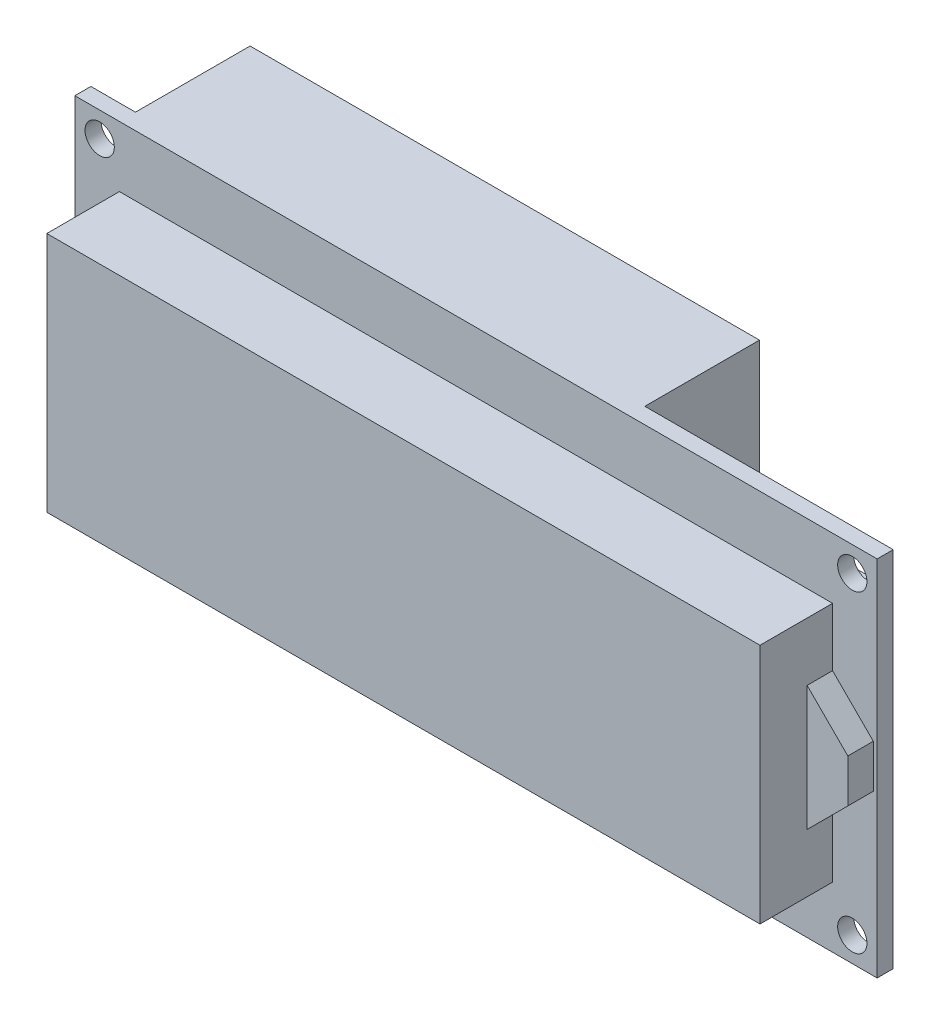
ISO-10303-21;
HEADER;
FILE_DESCRIPTION(('STEP AP214'),'2;1');
FILE_NAME('part.step','',(''),(''),'','','');
FILE_SCHEMA(('AUTOMOTIVE_DESIGN { 1 0 10303 214 1 1 1 1 }'));
ENDSEC;
DATA;
#1=APPLICATION_CONTEXT('core data for automotive mechanical design processes');
#2=APPLICATION_PROTOCOL_DEFINITION('international standard','automotive_design',2000,#1);
#3=PRODUCT_CONTEXT('',#1,'mechanical');
#4=PRODUCT('Part','Part','',(#3));
#5=PRODUCT_RELATED_PRODUCT_CATEGORY('part','',(#4));
#6=PRODUCT_DEFINITION_FORMATION('','',#4);
#7=PRODUCT_DEFINITION_CONTEXT('part definition',#1,'design');
#8=PRODUCT_DEFINITION('design','',#6,#7);
#9=PRODUCT_DEFINITION_SHAPE('','',#8);
#10=(LENGTH_UNIT() NAMED_UNIT(*) SI_UNIT(.MILLI.,.METRE.));
#11=(NAMED_UNIT(*) PLANE_ANGLE_UNIT() SI_UNIT($,.RADIAN.));
#12=(NAMED_UNIT(*) SI_UNIT($,.STERADIAN.) SOLID_ANGLE_UNIT());
#13=UNCERTAINTY_MEASURE_WITH_UNIT(LENGTH_MEASURE(1.E-05),#10,'distance_accuracy_value','');
#14=(GEOMETRIC_REPRESENTATION_CONTEXT(3) GLOBAL_UNCERTAINTY_ASSIGNED_CONTEXT((#13)) GLOBAL_UNIT_ASSIGNED_CONTEXT((#10,
#11,#12)) REPRESENTATION_CONTEXT('',''));
#15=CARTESIAN_POINT('',(0.,0.,0.));
#16=DIRECTION('',(0.,0.,1.));
#17=DIRECTION('',(1.,0.,0.));
#18=AXIS2_PLACEMENT_3D('',#15,#16,#17);
#19=CARTESIAN_POINT('',(0.,0.,0.));
#20=DIRECTION('',(0.,0.,-1.));
#21=DIRECTION('',(-1.,0.,0.));
#22=AXIS2_PLACEMENT_3D('',#19,#20,#21);
#23=PLANE('',#22);
#24=CARTESIAN_POINT('',(-37.5285,-15.621,0.));
#25=DIRECTION('',(0.,0.,1.));
#26=DIRECTION('',(-1.,0.,0.));
#27=AXIS2_PLACEMENT_3D('',#24,#25,#26);
#28=CIRCLE('',#27,1.4605);
#29=CARTESIAN_POINT('',(-38.989,-15.621,0.));
#30=VERTEX_POINT('',#29);
#31=EDGE_CURVE('E278',#30,#30,#28,.T.);
#32=ORIENTED_EDGE('',*,*,#31,.T.);
#33=EDGE_LOOP('',(#32));
#34=FACE_BOUND('',#33,.T.);
#35=CARTESIAN_POINT('',(37.5285,-15.621,0.));
#36=DIRECTION('',(0.,0.,1.));
#37=DIRECTION('',(1.,0.,0.));
#38=AXIS2_PLACEMENT_3D('',#35,#36,#37);
#39=CIRCLE('',#38,1.4605);
#40=CARTESIAN_POINT('',(38.989,-15.621,0.));
#41=VERTEX_POINT('',#40);
#42=EDGE_CURVE('E272',#41,#41,#39,.T.);
#43=ORIENTED_EDGE('',*,*,#42,.T.);
#44=EDGE_LOOP('',(#43));
#45=FACE_BOUND('',#44,.T.);
#46=CARTESIAN_POINT('',(37.5285,15.621,0.));
#47=DIRECTION('',(0.,0.,1.));
#48=DIRECTION('',(-1.,0.,0.));
#49=AXIS2_PLACEMENT_3D('',#46,#47,#48);
#50=CIRCLE('',#49,1.4605);
#51=CARTESIAN_POINT('',(36.068,15.621,0.));
#52=VERTEX_POINT('',#51);
#53=EDGE_CURVE('E265',#52,#52,#50,.T.);
#54=ORIENTED_EDGE('',*,*,#53,.T.);
#55=EDGE_LOOP('',(#54));
#56=FACE_BOUND('',#55,.T.);
#57=CARTESIAN_POINT('',(-37.5285,15.621,0.));
#58=DIRECTION('',(0.,0.,1.));
#59=DIRECTION('',(1.,0.,0.));
#60=AXIS2_PLACEMENT_3D('',#57,#58,#59);
#61=CIRCLE('',#60,1.4605);
#62=CARTESIAN_POINT('',(-36.068,15.621,0.));
#63=VERTEX_POINT('',#62);
#64=EDGE_CURVE('E283',#63,#63,#61,.T.);
#65=ORIENTED_EDGE('',*,*,#64,.T.);
#66=EDGE_LOOP('',(#65));
#67=FACE_BOUND('',#66,.T.);
#68=DIRECTION('',(1.,0.,0.));
#69=VECTOR('',#68,1.);
#70=CARTESIAN_POINT('',(-40.005,18.0975,0.));
#71=LINE('',#70,#69);
#72=CARTESIAN_POINT('',(-40.005,18.0975,0.));
#73=VERTEX_POINT('',#72);
#74=CARTESIAN_POINT('',(-35.56,18.0975,0.));
#75=VERTEX_POINT('',#74);
#76=EDGE_CURVE('E341',#73,#75,#71,.T.);
#77=ORIENTED_EDGE('',*,*,#76,.T.);
#78=DIRECTION('',(0.,-1.,0.));
#79=VECTOR('',#78,1.);
#80=CARTESIAN_POINT('',(-35.56,0.,0.));
#81=LINE('',#80,#79);
#82=CARTESIAN_POINT('',(-35.56,-12.065,0.));
#83=VERTEX_POINT('',#82);
#84=EDGE_CURVE('E58',#75,#83,#81,.T.);
#85=ORIENTED_EDGE('',*,*,#84,.T.);
#86=DIRECTION('',(-1.,0.,0.));
#87=VECTOR('',#86,1.);
#88=CARTESIAN_POINT('',(0.,-12.065,0.));
#89=LINE('',#88,#87);
#90=CARTESIAN_POINT('',(35.56,-12.065,0.));
#91=VERTEX_POINT('',#90);
#92=EDGE_CURVE('E205',#91,#83,#89,.T.);
#93=ORIENTED_EDGE('',*,*,#92,.F.);
#94=DIRECTION('',(0.,-1.,0.));
#95=VECTOR('',#94,1.);
#96=CARTESIAN_POINT('',(35.56,0.,0.));
#97=LINE('',#96,#95);
#98=CARTESIAN_POINT('',(35.56,12.065,0.));
#99=VERTEX_POINT('',#98);
#100=EDGE_CURVE('E217',#99,#91,#97,.T.);
#101=ORIENTED_EDGE('',*,*,#100,.F.);
#102=DIRECTION('',(-1.,0.,0.));
#103=VECTOR('',#102,1.);
#104=CARTESIAN_POINT('',(0.,12.065,0.));
#105=LINE('',#104,#103);
#106=CARTESIAN_POINT('',(15.24,12.065,0.));
#107=VERTEX_POINT('',#106);
#108=EDGE_CURVE('E215',#99,#107,#105,.T.);
#109=ORIENTED_EDGE('',*,*,#108,.T.);
#110=DIRECTION('',(0.,-1.,0.));
#111=VECTOR('',#110,1.);
#112=CARTESIAN_POINT('',(15.24,0.,0.));
#113=LINE('',#112,#111);
#114=CARTESIAN_POINT('',(15.24,18.0975,0.));
#115=VERTEX_POINT('',#114);
#116=EDGE_CURVE('E197',#115,#107,#113,.T.);
#117=ORIENTED_EDGE('',*,*,#116,.F.);
#118=CARTESIAN_POINT('',(40.005,18.0975,0.));
#119=VERTEX_POINT('',#118);
#120=EDGE_CURVE('E340',#115,#119,#71,.T.);
#121=ORIENTED_EDGE('',*,*,#120,.T.);
#122=DIRECTION('',(0.,-1.,0.));
#123=VECTOR('',#122,1.);
#124=CARTESIAN_POINT('',(40.005,18.0975,0.));
#125=LINE('',#124,#123);
#126=CARTESIAN_POINT('',(40.005,-18.0975,0.));
#127=VERTEX_POINT('',#126);
#128=EDGE_CURVE('E337',#119,#127,#125,.T.);
#129=ORIENTED_EDGE('',*,*,#128,.T.);
#130=DIRECTION('',(1.,0.,0.));
#131=VECTOR('',#130,1.);
#132=CARTESIAN_POINT('',(-40.005,-18.0975,0.));
#133=LINE('',#132,#131);
#134=CARTESIAN_POINT('',(-40.005,-18.0975,0.));
#135=VERTEX_POINT('',#134);
#136=EDGE_CURVE('E322',#135,#127,#133,.T.);
#137=ORIENTED_EDGE('',*,*,#136,.F.);
#138=DIRECTION('',(0.,-1.,0.));
#139=VECTOR('',#138,1.);
#140=CARTESIAN_POINT('',(-40.005,18.0975,0.));
#141=LINE('',#140,#139);
#142=EDGE_CURVE('E326',#73,#135,#141,.T.);
#143=ORIENTED_EDGE('',*,*,#142,.F.);
#144=EDGE_LOOP('',(#77,#85,#93,#101,#109,#117,#121,#129,#137,#143));
#145=FACE_BOUND('',#144,.T.);
#146=ADVANCED_FACE('F35',(#34,#45,#56,#67,#145),#23,.T.);
#147=CARTESIAN_POINT('',(0.,0.,1.6002));
#148=DIRECTION('',(0.,0.,-1.));
#149=DIRECTION('',(-1.,0.,0.));
#150=AXIS2_PLACEMENT_3D('',#147,#148,#149);
#151=PLANE('',#150);
#152=DIRECTION('',(1.,0.,0.));
#153=VECTOR('',#152,1.);
#154=CARTESIAN_POINT('',(-40.005,-18.0975,1.6002));
#155=LINE('',#154,#153);
#156=CARTESIAN_POINT('',(-40.005,-18.0975,1.6002));
#157=VERTEX_POINT('',#156);
#158=CARTESIAN_POINT('',(40.005,-18.0975,1.6002));
#159=VERTEX_POINT('',#158);
#160=EDGE_CURVE('E323',#157,#159,#155,.T.);
#161=ORIENTED_EDGE('',*,*,#160,.T.);
#162=DIRECTION('',(0.,-1.,0.));
#163=VECTOR('',#162,1.);
#164=CARTESIAN_POINT('',(40.005,18.0975,1.6002));
#165=LINE('',#164,#163);
#166=CARTESIAN_POINT('',(40.005,18.0975,1.6002));
#167=VERTEX_POINT('',#166);
#168=EDGE_CURVE('E325',#167,#159,#165,.T.);
#169=ORIENTED_EDGE('',*,*,#168,.F.);
#170=DIRECTION('',(1.,0.,0.));
#171=VECTOR('',#170,1.);
#172=CARTESIAN_POINT('',(-40.005,18.0975,1.6002));
#173=LINE('',#172,#171);
#174=CARTESIAN_POINT('',(-40.005,18.0975,1.6002));
#175=VERTEX_POINT('',#174);
#176=EDGE_CURVE('E329',#175,#167,#173,.T.);
#177=ORIENTED_EDGE('',*,*,#176,.F.);
#178=DIRECTION('',(0.,-1.,0.));
#179=VECTOR('',#178,1.);
#180=CARTESIAN_POINT('',(-40.005,18.0975,1.6002));
#181=LINE('',#180,#179);
#182=EDGE_CURVE('E332',#175,#157,#181,.T.);
#183=ORIENTED_EDGE('',*,*,#182,.T.);
#184=EDGE_LOOP('',(#161,#169,#177,#183));
#185=FACE_BOUND('',#184,.T.);
#186=CARTESIAN_POINT('',(-37.5285,15.621,1.6002));
#187=DIRECTION('',(0.,0.,1.));
#188=DIRECTION('',(1.,0.,0.));
#189=AXIS2_PLACEMENT_3D('',#186,#187,#188);
#190=CIRCLE('',#189,1.4605);
#191=CARTESIAN_POINT('',(-36.068,15.621,1.6002));
#192=VERTEX_POINT('',#191);
#193=EDGE_CURVE('E268',#192,#192,#190,.T.);
#194=ORIENTED_EDGE('',*,*,#193,.F.);
#195=EDGE_LOOP('',(#194));
#196=FACE_BOUND('',#195,.T.);
#197=CARTESIAN_POINT('',(37.5285,15.621,1.6002));
#198=DIRECTION('',(0.,0.,1.));
#199=DIRECTION('',(-1.,0.,0.));
#200=AXIS2_PLACEMENT_3D('',#197,#198,#199);
#201=CIRCLE('',#200,1.4605);
#202=CARTESIAN_POINT('',(36.068,15.621,1.6002));
#203=VERTEX_POINT('',#202);
#204=EDGE_CURVE('E269',#203,#203,#201,.T.);
#205=ORIENTED_EDGE('',*,*,#204,.F.);
#206=EDGE_LOOP('',(#205));
#207=FACE_BOUND('',#206,.T.);
#208=CARTESIAN_POINT('',(37.5285,-15.621,1.6002));
#209=DIRECTION('',(0.,0.,1.));
#210=DIRECTION('',(1.,0.,0.));
#211=AXIS2_PLACEMENT_3D('',#208,#209,#210);
#212=CIRCLE('',#211,1.4605);
#213=CARTESIAN_POINT('',(38.989,-15.621,1.6002));
#214=VERTEX_POINT('',#213);
#215=EDGE_CURVE('E275',#214,#214,#212,.T.);
#216=ORIENTED_EDGE('',*,*,#215,.F.);
#217=EDGE_LOOP('',(#216));
#218=FACE_BOUND('',#217,.T.);
#219=CARTESIAN_POINT('',(-37.5285,-15.621,1.6002));
#220=DIRECTION('',(0.,0.,1.));
#221=DIRECTION('',(-1.,0.,0.));
#222=AXIS2_PLACEMENT_3D('',#219,#220,#221);
#223=CIRCLE('',#222,1.4605);
#224=CARTESIAN_POINT('',(-38.989,-15.621,1.6002));
#225=VERTEX_POINT('',#224);
#226=EDGE_CURVE('E264',#225,#225,#223,.T.);
#227=ORIENTED_EDGE('',*,*,#226,.F.);
#228=EDGE_LOOP('',(#227));
#229=FACE_BOUND('',#228,.T.);
#230=DIRECTION('',(0.707106781186548,0.707106781186547,0.));
#231=VECTOR('',#230,1.);
#232=CARTESIAN_POINT('',(35.56,-6.223,1.6002));
#233=LINE('',#232,#231);
#234=CARTESIAN_POINT('',(35.56,-6.223,1.6002));
#235=VERTEX_POINT('',#234);
#236=CARTESIAN_POINT('',(39.624,-2.159,1.6002));
#237=VERTEX_POINT('',#236);
#238=EDGE_CURVE('E237',#235,#237,#233,.T.);
#239=ORIENTED_EDGE('',*,*,#238,.F.);
#240=DIRECTION('',(0.,1.,0.));
#241=VECTOR('',#240,1.);
#242=CARTESIAN_POINT('',(35.56,12.0396,1.6002));
#243=LINE('',#242,#241);
#244=CARTESIAN_POINT('',(35.56,-12.0396,1.6002));
#245=VERTEX_POINT('',#244);
#246=EDGE_CURVE('E300',#245,#235,#243,.T.);
#247=ORIENTED_EDGE('',*,*,#246,.F.);
#248=DIRECTION('',(1.,0.,0.));
#249=VECTOR('',#248,1.);
#250=CARTESIAN_POINT('',(-35.56,-12.0396,1.6002));
#251=LINE('',#250,#249);
#252=CARTESIAN_POINT('',(-35.56,-12.0396,1.6002));
#253=VERTEX_POINT('',#252);
#254=EDGE_CURVE('E293',#253,#245,#251,.T.);
#255=ORIENTED_EDGE('',*,*,#254,.F.);
#256=DIRECTION('',(0.,-1.,0.));
#257=VECTOR('',#256,1.);
#258=CARTESIAN_POINT('',(-35.56,12.0396,1.6002));
#259=LINE('',#258,#257);
#260=CARTESIAN_POINT('',(-35.56,12.0396,1.6002));
#261=VERTEX_POINT('',#260);
#262=EDGE_CURVE('E306',#261,#253,#259,.T.);
#263=ORIENTED_EDGE('',*,*,#262,.F.);
#264=DIRECTION('',(-1.,0.,0.));
#265=VECTOR('',#264,1.);
#266=CARTESIAN_POINT('',(-35.56,12.0396,1.6002));
#267=LINE('',#266,#265);
#268=CARTESIAN_POINT('',(35.56,12.0396,1.6002));
#269=VERTEX_POINT('',#268);
#270=EDGE_CURVE('E303',#269,#261,#267,.T.);
#271=ORIENTED_EDGE('',*,*,#270,.F.);
#272=CARTESIAN_POINT('',(35.56,6.223,1.6002));
#273=VERTEX_POINT('',#272);
#274=EDGE_CURVE('E286',#273,#269,#243,.T.);
#275=ORIENTED_EDGE('',*,*,#274,.F.);
#276=DIRECTION('',(-0.707106781186547,0.707106781186548,0.));
#277=VECTOR('',#276,1.);
#278=CARTESIAN_POINT('',(35.56,6.223,1.6002));
#279=LINE('',#278,#277);
#280=CARTESIAN_POINT('',(39.624,2.159,1.6002));
#281=VERTEX_POINT('',#280);
#282=EDGE_CURVE('E242',#281,#273,#279,.T.);
#283=ORIENTED_EDGE('',*,*,#282,.F.);
#284=DIRECTION('',(0.,1.,0.));
#285=VECTOR('',#284,1.);
#286=CARTESIAN_POINT('',(39.624,2.159,1.6002));
#287=LINE('',#286,#285);
#288=EDGE_CURVE('E251',#237,#281,#287,.T.);
#289=ORIENTED_EDGE('',*,*,#288,.F.);
#290=EDGE_LOOP('',(#239,#247,#255,#263,#271,#275,#283,#289));
#291=FACE_BOUND('',#290,.T.);
#292=ADVANCED_FACE('F385',(#185,#196,#207,#218,#229,#291),#151,.F.);
#293=CARTESIAN_POINT('',(35.56,12.0396,8.8392));
#294=DIRECTION('',(-1.,0.,0.));
#295=DIRECTION('',(0.,0.,1.));
#296=AXIS2_PLACEMENT_3D('',#293,#294,#295);
#297=PLANE('',#296);
#298=DIRECTION('',(0.,0.,-1.));
#299=VECTOR('',#298,1.);
#300=CARTESIAN_POINT('',(35.56,-6.223,4.1402));
#301=LINE('',#300,#299);
#302=CARTESIAN_POINT('',(35.56,-6.223,4.1402));
#303=VERTEX_POINT('',#302);
#304=EDGE_CURVE('E262',#303,#235,#301,.T.);
#305=ORIENTED_EDGE('',*,*,#304,.F.);
#306=DIRECTION('',(0.,-1.,0.));
#307=VECTOR('',#306,1.);
#308=CARTESIAN_POINT('',(35.56,6.223,4.1402));
#309=LINE('',#308,#307);
#310=CARTESIAN_POINT('',(35.56,6.223,4.1402));
#311=VERTEX_POINT('',#310);
#312=EDGE_CURVE('E238',#311,#303,#309,.T.);
#313=ORIENTED_EDGE('',*,*,#312,.F.);
#314=DIRECTION('',(0.,0.,-1.));
#315=VECTOR('',#314,1.);
#316=CARTESIAN_POINT('',(35.56,6.223,4.1402));
#317=LINE('',#316,#315);
#318=EDGE_CURVE('E249',#311,#273,#317,.T.);
#319=ORIENTED_EDGE('',*,*,#318,.T.);
#320=ORIENTED_EDGE('',*,*,#274,.T.);
#321=DIRECTION('',(0.,0.,-1.));
#322=VECTOR('',#321,1.);
#323=CARTESIAN_POINT('',(35.56,12.0396,8.8392));
#324=LINE('',#323,#322);
#325=CARTESIAN_POINT('',(35.56,12.0396,8.8392));
#326=VERTEX_POINT('',#325);
#327=EDGE_CURVE('E319',#326,#269,#324,.T.);
#328=ORIENTED_EDGE('',*,*,#327,.F.);
#329=DIRECTION('',(0.,1.,0.));
#330=VECTOR('',#329,1.);
#331=CARTESIAN_POINT('',(35.56,12.0396,8.8392));
#332=LINE('',#331,#330);
#333=CARTESIAN_POINT('',(35.56,-12.0396,8.8392));
#334=VERTEX_POINT('',#333);
#335=EDGE_CURVE('E289',#334,#326,#332,.T.);
#336=ORIENTED_EDGE('',*,*,#335,.F.);
#337=DIRECTION('',(0.,0.,-1.));
#338=VECTOR('',#337,1.);
#339=CARTESIAN_POINT('',(35.56,-12.0396,8.8392));
#340=LINE('',#339,#338);
#341=EDGE_CURVE('E299',#334,#245,#340,.T.);
#342=ORIENTED_EDGE('',*,*,#341,.T.);
#343=ORIENTED_EDGE('',*,*,#246,.T.);
#344=EDGE_LOOP('',(#305,#313,#319,#320,#328,#336,#342,#343));
#345=FACE_BOUND('',#344,.T.);
#346=ADVANCED_FACE('F388',(#345),#297,.F.);
#347=CARTESIAN_POINT('',(-40.005,-18.0975,1.6002));
#348=DIRECTION('',(0.,1.,0.));
#349=DIRECTION('',(0.,0.,1.));
#350=AXIS2_PLACEMENT_3D('',#347,#348,#349);
#351=PLANE('',#350);
#352=ORIENTED_EDGE('',*,*,#136,.T.);
#353=DIRECTION('',(0.,0.,-1.));
#354=VECTOR('',#353,1.);
#355=CARTESIAN_POINT('',(40.005,-18.0975,1.6002));
#356=LINE('',#355,#354);
#357=EDGE_CURVE('E39',#159,#127,#356,.T.);
#358=ORIENTED_EDGE('',*,*,#357,.F.);
#359=ORIENTED_EDGE('',*,*,#160,.F.);
#360=DIRECTION('',(0.,0.,-1.));
#361=VECTOR('',#360,1.);
#362=CARTESIAN_POINT('',(-40.005,-18.0975,1.6002));
#363=LINE('',#362,#361);
#364=EDGE_CURVE('E334',#157,#135,#363,.T.);
#365=ORIENTED_EDGE('',*,*,#364,.T.);
#366=EDGE_LOOP('',(#352,#358,#359,#365));
#367=FACE_BOUND('',#366,.T.);
#368=ADVANCED_FACE('F37',(#367),#351,.F.);
#369=CARTESIAN_POINT('',(40.005,18.0975,1.6002));
#370=DIRECTION('',(1.,0.,0.));
#371=DIRECTION('',(0.,1.,0.));
#372=AXIS2_PLACEMENT_3D('',#369,#370,#371);
#373=PLANE('',#372);
#374=ORIENTED_EDGE('',*,*,#128,.F.);
#375=DIRECTION('',(0.,0.,-1.));
#376=VECTOR('',#375,1.);
#377=CARTESIAN_POINT('',(40.005,18.0975,1.6002));
#378=LINE('',#377,#376);
#379=EDGE_CURVE('E347',#167,#119,#378,.T.);
#380=ORIENTED_EDGE('',*,*,#379,.F.);
#381=ORIENTED_EDGE('',*,*,#168,.T.);
#382=ORIENTED_EDGE('',*,*,#357,.T.);
#383=EDGE_LOOP('',(#374,#380,#381,#382));
#384=FACE_BOUND('',#383,.T.);
#385=ADVANCED_FACE('F354',(#384),#373,.T.);
#386=CARTESIAN_POINT('',(-40.005,18.0975,1.6002));
#387=DIRECTION('',(0.,1.,0.));
#388=DIRECTION('',(0.,0.,1.));
#389=AXIS2_PLACEMENT_3D('',#386,#387,#388);
#390=PLANE('',#389);
#391=ORIENTED_EDGE('',*,*,#76,.F.);
#392=DIRECTION('',(0.,0.,-1.));
#393=VECTOR('',#392,1.);
#394=CARTESIAN_POINT('',(-40.005,18.0975,1.6002));
#395=LINE('',#394,#393);
#396=EDGE_CURVE('E346',#175,#73,#395,.T.);
#397=ORIENTED_EDGE('',*,*,#396,.F.);
#398=ORIENTED_EDGE('',*,*,#176,.T.);
#399=ORIENTED_EDGE('',*,*,#379,.T.);
#400=ORIENTED_EDGE('',*,*,#120,.F.);
#401=DIRECTION('',(0.,0.,1.));
#402=VECTOR('',#401,1.);
#403=CARTESIAN_POINT('',(15.24,18.0975,-2.54));
#404=LINE('',#403,#402);
#405=CARTESIAN_POINT('',(15.24,18.0975,-11.43));
#406=VERTEX_POINT('',#405);
#407=EDGE_CURVE('E232',#406,#115,#404,.T.);
#408=ORIENTED_EDGE('',*,*,#407,.F.);
#409=DIRECTION('',(1.,0.,0.));
#410=VECTOR('',#409,1.);
#411=CARTESIAN_POINT('',(15.24,18.0975,-11.43));
#412=LINE('',#411,#410);
#413=CARTESIAN_POINT('',(-35.56,18.0975,-11.43));
#414=VERTEX_POINT('',#413);
#415=EDGE_CURVE('E189',#414,#406,#412,.T.);
#416=ORIENTED_EDGE('',*,*,#415,.F.);
#417=DIRECTION('',(0.,0.,1.));
#418=VECTOR('',#417,1.);
#419=CARTESIAN_POINT('',(-35.56,18.0975,-2.54));
#420=LINE('',#419,#418);
#421=EDGE_CURVE('E234',#414,#75,#420,.T.);
#422=ORIENTED_EDGE('',*,*,#421,.T.);
#423=EDGE_LOOP('',(#391,#397,#398,#399,#400,#408,#416,#422));
#424=FACE_BOUND('',#423,.T.);
#425=ADVANCED_FACE('F362',(#424),#390,.T.);
#426=CARTESIAN_POINT('',(-40.005,18.0975,1.6002));
#427=DIRECTION('',(1.,0.,0.));
#428=DIRECTION('',(0.,1.,0.));
#429=AXIS2_PLACEMENT_3D('',#426,#427,#428);
#430=PLANE('',#429);
#431=ORIENTED_EDGE('',*,*,#142,.T.);
#432=ORIENTED_EDGE('',*,*,#364,.F.);
#433=ORIENTED_EDGE('',*,*,#182,.F.);
#434=ORIENTED_EDGE('',*,*,#396,.T.);
#435=EDGE_LOOP('',(#431,#432,#433,#434));
#436=FACE_BOUND('',#435,.T.);
#437=ADVANCED_FACE('F382',(#436),#430,.F.);
#438=CARTESIAN_POINT('',(-35.56,12.0396,8.8392));
#439=DIRECTION('',(0.,-1.,0.));
#440=DIRECTION('',(0.,0.,-1.));
#441=AXIS2_PLACEMENT_3D('',#438,#439,#440);
#442=PLANE('',#441);
#443=ORIENTED_EDGE('',*,*,#270,.T.);
#444=DIRECTION('',(0.,0.,-1.));
#445=VECTOR('',#444,1.);
#446=CARTESIAN_POINT('',(-35.56,12.0396,8.8392));
#447=LINE('',#446,#445);
#448=CARTESIAN_POINT('',(-35.56,12.0396,8.8392));
#449=VERTEX_POINT('',#448);
#450=EDGE_CURVE('E316',#449,#261,#447,.T.);
#451=ORIENTED_EDGE('',*,*,#450,.F.);
#452=DIRECTION('',(-1.,0.,0.));
#453=VECTOR('',#452,1.);
#454=CARTESIAN_POINT('',(-35.56,12.0396,8.8392));
#455=LINE('',#454,#453);
#456=EDGE_CURVE('E292',#326,#449,#455,.T.);
#457=ORIENTED_EDGE('',*,*,#456,.F.);
#458=ORIENTED_EDGE('',*,*,#327,.T.);
#459=EDGE_LOOP('',(#443,#451,#457,#458));
#460=FACE_BOUND('',#459,.T.);
#461=ADVANCED_FACE('F419',(#460),#442,.F.);
#462=CARTESIAN_POINT('',(-35.56,12.0396,8.8392));
#463=DIRECTION('',(1.,0.,0.));
#464=DIRECTION('',(0.,0.,-1.));
#465=AXIS2_PLACEMENT_3D('',#462,#463,#464);
#466=PLANE('',#465);
#467=ORIENTED_EDGE('',*,*,#262,.T.);
#468=DIRECTION('',(0.,0.,-1.));
#469=VECTOR('',#468,1.);
#470=CARTESIAN_POINT('',(-35.56,-12.0396,8.8392));
#471=LINE('',#470,#469);
#472=CARTESIAN_POINT('',(-35.56,-12.0396,8.8392));
#473=VERTEX_POINT('',#472);
#474=EDGE_CURVE('E313',#473,#253,#471,.T.);
#475=ORIENTED_EDGE('',*,*,#474,.F.);
#476=DIRECTION('',(0.,-1.,0.));
#477=VECTOR('',#476,1.);
#478=CARTESIAN_POINT('',(-35.56,12.0396,8.8392));
#479=LINE('',#478,#477);
#480=EDGE_CURVE('E295',#449,#473,#479,.T.);
#481=ORIENTED_EDGE('',*,*,#480,.F.);
#482=ORIENTED_EDGE('',*,*,#450,.T.);
#483=EDGE_LOOP('',(#467,#475,#481,#482));
#484=FACE_BOUND('',#483,.T.);
#485=ADVANCED_FACE('F415',(#484),#466,.F.);
#486=CARTESIAN_POINT('',(-35.56,-12.0396,8.8392));
#487=DIRECTION('',(0.,1.,0.));
#488=DIRECTION('',(0.,0.,1.));
#489=AXIS2_PLACEMENT_3D('',#486,#487,#488);
#490=PLANE('',#489);
#491=ORIENTED_EDGE('',*,*,#254,.T.);
#492=ORIENTED_EDGE('',*,*,#341,.F.);
#493=DIRECTION('',(1.,0.,0.));
#494=VECTOR('',#493,1.);
#495=CARTESIAN_POINT('',(-35.56,-12.0396,8.8392));
#496=LINE('',#495,#494);
#497=EDGE_CURVE('E297',#473,#334,#496,.T.);
#498=ORIENTED_EDGE('',*,*,#497,.F.);
#499=ORIENTED_EDGE('',*,*,#474,.T.);
#500=EDGE_LOOP('',(#491,#492,#498,#499));
#501=FACE_BOUND('',#500,.T.);
#502=ADVANCED_FACE('F411',(#501),#490,.F.);
#503=CARTESIAN_POINT('',(0.,0.,8.8392));
#504=DIRECTION('',(0.,0.,1.));
#505=DIRECTION('',(1.,0.,0.));
#506=AXIS2_PLACEMENT_3D('',#503,#504,#505);
#507=PLANE('',#506);
#508=ORIENTED_EDGE('',*,*,#335,.T.);
#509=ORIENTED_EDGE('',*,*,#456,.T.);
#510=ORIENTED_EDGE('',*,*,#480,.T.);
#511=ORIENTED_EDGE('',*,*,#497,.T.);
#512=EDGE_LOOP('',(#508,#509,#510,#511));
#513=FACE_BOUND('',#512,.T.);
#514=ADVANCED_FACE('F470',(#513),#507,.T.);
#515=CARTESIAN_POINT('',(-37.5285,15.621,0.));
#516=DIRECTION('',(0.,0.,1.));
#517=DIRECTION('',(1.,0.,0.));
#518=AXIS2_PLACEMENT_3D('',#515,#516,#517);
#519=CYLINDRICAL_SURFACE('',#518,1.4605);
#520=ORIENTED_EDGE('',*,*,#64,.F.);
#521=EDGE_LOOP('',(#520));
#522=FACE_BOUND('',#521,.T.);
#523=ORIENTED_EDGE('',*,*,#193,.T.);
#524=EDGE_LOOP('',(#523));
#525=FACE_BOUND('',#524,.T.);
#526=ADVANCED_FACE('F473',(#522,#525),#519,.F.);
#527=CARTESIAN_POINT('',(37.5285,15.621,0.));
#528=DIRECTION('',(0.,0.,1.));
#529=DIRECTION('',(1.,0.,0.));
#530=AXIS2_PLACEMENT_3D('',#527,#528,#529);
#531=CYLINDRICAL_SURFACE('',#530,1.4605);
#532=ORIENTED_EDGE('',*,*,#53,.F.);
#533=EDGE_LOOP('',(#532));
#534=FACE_BOUND('',#533,.T.);
#535=ORIENTED_EDGE('',*,*,#204,.T.);
#536=EDGE_LOOP('',(#535));
#537=FACE_BOUND('',#536,.T.);
#538=ADVANCED_FACE('F476',(#534,#537),#531,.F.);
#539=CARTESIAN_POINT('',(37.5285,-15.621,0.));
#540=DIRECTION('',(0.,0.,1.));
#541=DIRECTION('',(1.,0.,0.));
#542=AXIS2_PLACEMENT_3D('',#539,#540,#541);
#543=CYLINDRICAL_SURFACE('',#542,1.4605);
#544=ORIENTED_EDGE('',*,*,#42,.F.);
#545=EDGE_LOOP('',(#544));
#546=FACE_BOUND('',#545,.T.);
#547=ORIENTED_EDGE('',*,*,#215,.T.);
#548=EDGE_LOOP('',(#547));
#549=FACE_BOUND('',#548,.T.);
#550=ADVANCED_FACE('F439',(#546,#549),#543,.F.);
#551=CARTESIAN_POINT('',(-37.5285,-15.621,0.));
#552=DIRECTION('',(0.,0.,1.));
#553=DIRECTION('',(1.,0.,0.));
#554=AXIS2_PLACEMENT_3D('',#551,#552,#553);
#555=CYLINDRICAL_SURFACE('',#554,1.4605);
#556=ORIENTED_EDGE('',*,*,#31,.F.);
#557=EDGE_LOOP('',(#556));
#558=FACE_BOUND('',#557,.T.);
#559=ORIENTED_EDGE('',*,*,#226,.T.);
#560=EDGE_LOOP('',(#559));
#561=FACE_BOUND('',#560,.T.);
#562=ADVANCED_FACE('F432',(#558,#561),#555,.F.);
#563=CARTESIAN_POINT('',(35.56,-6.223,4.1402));
#564=DIRECTION('',(-0.707106781186547,0.707106781186548,0.));
#565=DIRECTION('',(-0.707106781186548,-0.707106781186547,0.));
#566=AXIS2_PLACEMENT_3D('',#563,#564,#565);
#567=PLANE('',#566);
#568=ORIENTED_EDGE('',*,*,#238,.T.);
#569=DIRECTION('',(0.,0.,-1.));
#570=VECTOR('',#569,1.);
#571=CARTESIAN_POINT('',(39.624,-2.159,4.1402));
#572=LINE('',#571,#570);
#573=CARTESIAN_POINT('',(39.624,-2.159,4.1402));
#574=VERTEX_POINT('',#573);
#575=EDGE_CURVE('E259',#574,#237,#572,.T.);
#576=ORIENTED_EDGE('',*,*,#575,.F.);
#577=DIRECTION('',(0.707106781186548,0.707106781186547,0.));
#578=VECTOR('',#577,1.);
#579=CARTESIAN_POINT('',(35.56,-6.223,4.1402));
#580=LINE('',#579,#578);
#581=EDGE_CURVE('E241',#303,#574,#580,.T.);
#582=ORIENTED_EDGE('',*,*,#581,.F.);
#583=ORIENTED_EDGE('',*,*,#304,.T.);
#584=EDGE_LOOP('',(#568,#576,#582,#583));
#585=FACE_BOUND('',#584,.T.);
#586=ADVANCED_FACE('F430',(#585),#567,.F.);
#587=CARTESIAN_POINT('',(39.624,2.159,4.1402));
#588=DIRECTION('',(-1.,0.,0.));
#589=DIRECTION('',(0.,0.,1.));
#590=AXIS2_PLACEMENT_3D('',#587,#588,#589);
#591=PLANE('',#590);
#592=ORIENTED_EDGE('',*,*,#288,.T.);
#593=DIRECTION('',(0.,0.,-1.));
#594=VECTOR('',#593,1.);
#595=CARTESIAN_POINT('',(39.624,2.159,4.1402));
#596=LINE('',#595,#594);
#597=CARTESIAN_POINT('',(39.624,2.159,4.1402));
#598=VERTEX_POINT('',#597);
#599=EDGE_CURVE('E256',#598,#281,#596,.T.);
#600=ORIENTED_EDGE('',*,*,#599,.F.);
#601=DIRECTION('',(0.,1.,0.));
#602=VECTOR('',#601,1.);
#603=CARTESIAN_POINT('',(39.624,2.159,4.1402));
#604=LINE('',#603,#602);
#605=EDGE_CURVE('E244',#574,#598,#604,.T.);
#606=ORIENTED_EDGE('',*,*,#605,.F.);
#607=ORIENTED_EDGE('',*,*,#575,.T.);
#608=EDGE_LOOP('',(#592,#600,#606,#607));
#609=FACE_BOUND('',#608,.T.);
#610=ADVANCED_FACE('F429',(#609),#591,.F.);
#611=CARTESIAN_POINT('',(35.56,6.223,4.1402));
#612=DIRECTION('',(-0.707106781186548,-0.707106781186547,0.));
#613=DIRECTION('',(0.707106781186547,-0.707106781186548,0.));
#614=AXIS2_PLACEMENT_3D('',#611,#612,#613);
#615=PLANE('',#614);
#616=ORIENTED_EDGE('',*,*,#282,.T.);
#617=ORIENTED_EDGE('',*,*,#318,.F.);
#618=DIRECTION('',(-0.707106781186547,0.707106781186548,0.));
#619=VECTOR('',#618,1.);
#620=CARTESIAN_POINT('',(35.56,6.223,4.1402));
#621=LINE('',#620,#619);
#622=EDGE_CURVE('E246',#598,#311,#621,.T.);
#623=ORIENTED_EDGE('',*,*,#622,.F.);
#624=ORIENTED_EDGE('',*,*,#599,.T.);
#625=EDGE_LOOP('',(#616,#617,#623,#624));
#626=FACE_BOUND('',#625,.T.);
#627=ADVANCED_FACE('F423',(#626),#615,.F.);
#628=CARTESIAN_POINT('',(0.,0.,4.1402));
#629=DIRECTION('',(0.,0.,1.));
#630=DIRECTION('',(1.,0.,0.));
#631=AXIS2_PLACEMENT_3D('',#628,#629,#630);
#632=PLANE('',#631);
#633=ORIENTED_EDGE('',*,*,#312,.T.);
#634=ORIENTED_EDGE('',*,*,#581,.T.);
#635=ORIENTED_EDGE('',*,*,#605,.T.);
#636=ORIENTED_EDGE('',*,*,#622,.T.);
#637=EDGE_LOOP('',(#633,#634,#635,#636));
#638=FACE_BOUND('',#637,.T.);
#639=ADVANCED_FACE('F425',(#638),#632,.T.);
#640=CARTESIAN_POINT('',(-35.56,0.,-2.54));
#641=DIRECTION('',(-1.,0.,0.));
#642=DIRECTION('',(0.,0.,1.));
#643=AXIS2_PLACEMENT_3D('',#640,#641,#642);
#644=PLANE('',#643);
#645=ORIENTED_EDGE('',*,*,#84,.F.);
#646=ORIENTED_EDGE('',*,*,#421,.F.);
#647=DIRECTION('',(0.,1.,0.));
#648=VECTOR('',#647,1.);
#649=CARTESIAN_POINT('',(-35.56,18.0975,-11.43));
#650=LINE('',#649,#648);
#651=CARTESIAN_POINT('',(-35.56,-1.7145,-11.43));
#652=VERTEX_POINT('',#651);
#653=EDGE_CURVE('E182',#652,#414,#650,.T.);
#654=ORIENTED_EDGE('',*,*,#653,.F.);
#655=DIRECTION('',(0.,0.,1.));
#656=VECTOR('',#655,1.);
#657=CARTESIAN_POINT('',(-35.56,-1.7145,-11.43));
#658=LINE('',#657,#656);
#659=CARTESIAN_POINT('',(-35.56,-1.7145,-2.54));
#660=VERTEX_POINT('',#659);
#661=EDGE_CURVE('E178',#652,#660,#658,.T.);
#662=ORIENTED_EDGE('',*,*,#661,.T.);
#663=DIRECTION('',(0.,-1.,0.));
#664=VECTOR('',#663,1.);
#665=CARTESIAN_POINT('',(-35.56,0.,-2.54));
#666=LINE('',#665,#664);
#667=CARTESIAN_POINT('',(-35.56,-12.065,-2.54));
#668=VERTEX_POINT('',#667);
#669=EDGE_CURVE('E202',#660,#668,#666,.T.);
#670=ORIENTED_EDGE('',*,*,#669,.T.);
#671=DIRECTION('',(0.,0.,1.));
#672=VECTOR('',#671,1.);
#673=CARTESIAN_POINT('',(-35.56,-12.065,-2.54));
#674=LINE('',#673,#672);
#675=EDGE_CURVE('E212',#668,#83,#674,.T.);
#676=ORIENTED_EDGE('',*,*,#675,.T.);
#677=EDGE_LOOP('',(#645,#646,#654,#662,#670,#676));
#678=FACE_BOUND('',#677,.T.);
#679=ADVANCED_FACE('F377',(#678),#644,.T.);
#680=CARTESIAN_POINT('',(15.24,0.,-2.54));
#681=DIRECTION('',(-1.,0.,0.));
#682=DIRECTION('',(0.,-1.,0.));
#683=AXIS2_PLACEMENT_3D('',#680,#681,#682);
#684=PLANE('',#683);
#685=ORIENTED_EDGE('',*,*,#116,.T.);
#686=DIRECTION('',(0.,0.,1.));
#687=VECTOR('',#686,1.);
#688=CARTESIAN_POINT('',(15.24,12.065,-2.54));
#689=LINE('',#688,#687);
#690=CARTESIAN_POINT('',(15.24,12.065,-2.54));
#691=VERTEX_POINT('',#690);
#692=EDGE_CURVE('E229',#691,#107,#689,.T.);
#693=ORIENTED_EDGE('',*,*,#692,.F.);
#694=DIRECTION('',(0.,-1.,0.));
#695=VECTOR('',#694,1.);
#696=CARTESIAN_POINT('',(15.24,18.0975,-2.54));
#697=LINE('',#696,#695);
#698=CARTESIAN_POINT('',(15.24,-1.7145,-2.54));
#699=VERTEX_POINT('',#698);
#700=EDGE_CURVE('E11',#691,#699,#697,.T.);
#701=ORIENTED_EDGE('',*,*,#700,.T.);
#702=DIRECTION('',(0.,0.,1.));
#703=VECTOR('',#702,1.);
#704=CARTESIAN_POINT('',(15.24,-1.7145,-11.43));
#705=LINE('',#704,#703);
#706=CARTESIAN_POINT('',(15.24,-1.7145,-11.43));
#707=VERTEX_POINT('',#706);
#708=EDGE_CURVE('E176',#707,#699,#705,.T.);
#709=ORIENTED_EDGE('',*,*,#708,.F.);
#710=DIRECTION('',(0.,-1.,0.));
#711=VECTOR('',#710,1.);
#712=CARTESIAN_POINT('',(15.24,18.0975,-11.43));
#713=LINE('',#712,#711);
#714=EDGE_CURVE('E183',#406,#707,#713,.T.);
#715=ORIENTED_EDGE('',*,*,#714,.F.);
#716=ORIENTED_EDGE('',*,*,#407,.T.);
#717=EDGE_LOOP('',(#685,#693,#701,#709,#715,#716));
#718=FACE_BOUND('',#717,.T.);
#719=ADVANCED_FACE('F194',(#718),#684,.F.);
#720=CARTESIAN_POINT('',(0.,12.065,-2.54));
#721=DIRECTION('',(0.,1.,0.));
#722=DIRECTION('',(0.,0.,1.));
#723=AXIS2_PLACEMENT_3D('',#720,#721,#722);
#724=PLANE('',#723);
#725=ORIENTED_EDGE('',*,*,#108,.F.);
#726=DIRECTION('',(0.,0.,1.));
#727=VECTOR('',#726,1.);
#728=CARTESIAN_POINT('',(35.56,12.065,-2.54));
#729=LINE('',#728,#727);
#730=CARTESIAN_POINT('',(35.56,12.065,-2.54));
#731=VERTEX_POINT('',#730);
#732=EDGE_CURVE('E226',#731,#99,#729,.T.);
#733=ORIENTED_EDGE('',*,*,#732,.F.);
#734=DIRECTION('',(-1.,0.,0.));
#735=VECTOR('',#734,1.);
#736=CARTESIAN_POINT('',(0.,12.065,-2.54));
#737=LINE('',#736,#735);
#738=EDGE_CURVE('E204',#731,#691,#737,.T.);
#739=ORIENTED_EDGE('',*,*,#738,.T.);
#740=ORIENTED_EDGE('',*,*,#692,.T.);
#741=EDGE_LOOP('',(#725,#733,#739,#740));
#742=FACE_BOUND('',#741,.T.);
#743=ADVANCED_FACE('F366',(#742),#724,.T.);
#744=CARTESIAN_POINT('',(35.56,0.,-2.54));
#745=DIRECTION('',(-1.,0.,0.));
#746=DIRECTION('',(0.,0.,1.));
#747=AXIS2_PLACEMENT_3D('',#744,#745,#746);
#748=PLANE('',#747);
#749=ORIENTED_EDGE('',*,*,#100,.T.);
#750=DIRECTION('',(0.,0.,1.));
#751=VECTOR('',#750,1.);
#752=CARTESIAN_POINT('',(35.56,-12.065,-2.54));
#753=LINE('',#752,#751);
#754=CARTESIAN_POINT('',(35.56,-12.065,-2.54));
#755=VERTEX_POINT('',#754);
#756=EDGE_CURVE('E223',#755,#91,#753,.T.);
#757=ORIENTED_EDGE('',*,*,#756,.F.);
#758=DIRECTION('',(0.,-1.,0.));
#759=VECTOR('',#758,1.);
#760=CARTESIAN_POINT('',(35.56,0.,-2.54));
#761=LINE('',#760,#759);
#762=EDGE_CURVE('E208',#731,#755,#761,.T.);
#763=ORIENTED_EDGE('',*,*,#762,.F.);
#764=ORIENTED_EDGE('',*,*,#732,.T.);
#765=EDGE_LOOP('',(#749,#757,#763,#764));
#766=FACE_BOUND('',#765,.T.);
#767=ADVANCED_FACE('F373',(#766),#748,.F.);
#768=CARTESIAN_POINT('',(0.,-12.065,-2.54));
#769=DIRECTION('',(0.,1.,0.));
#770=DIRECTION('',(0.,0.,1.));
#771=AXIS2_PLACEMENT_3D('',#768,#769,#770);
#772=PLANE('',#771);
#773=ORIENTED_EDGE('',*,*,#92,.T.);
#774=ORIENTED_EDGE('',*,*,#675,.F.);
#775=DIRECTION('',(-1.,0.,0.));
#776=VECTOR('',#775,1.);
#777=CARTESIAN_POINT('',(0.,-12.065,-2.54));
#778=LINE('',#777,#776);
#779=EDGE_CURVE('E210',#755,#668,#778,.T.);
#780=ORIENTED_EDGE('',*,*,#779,.F.);
#781=ORIENTED_EDGE('',*,*,#756,.T.);
#782=EDGE_LOOP('',(#773,#774,#780,#781));
#783=FACE_BOUND('',#782,.T.);
#784=ADVANCED_FACE('F375',(#783),#772,.F.);
#785=CARTESIAN_POINT('',(0.,0.,-2.54));
#786=DIRECTION('',(0.,0.,-1.));
#787=DIRECTION('',(-1.,0.,0.));
#788=AXIS2_PLACEMENT_3D('',#785,#786,#787);
#789=PLANE('',#788);
#790=ORIENTED_EDGE('',*,*,#700,.F.);
#791=ORIENTED_EDGE('',*,*,#738,.F.);
#792=ORIENTED_EDGE('',*,*,#762,.T.);
#793=ORIENTED_EDGE('',*,*,#779,.T.);
#794=ORIENTED_EDGE('',*,*,#669,.F.);
#795=DIRECTION('',(-1.,0.,0.));
#796=VECTOR('',#795,1.);
#797=CARTESIAN_POINT('',(15.24,-1.7145,-2.54));
#798=LINE('',#797,#796);
#799=EDGE_CURVE('E51',#699,#660,#798,.T.);
#800=ORIENTED_EDGE('',*,*,#799,.F.);
#801=EDGE_LOOP('',(#790,#791,#792,#793,#794,#800));
#802=FACE_BOUND('',#801,.T.);
#803=ADVANCED_FACE('F368',(#802),#789,.T.);
#804=CARTESIAN_POINT('',(15.24,-1.7145,-11.43));
#805=DIRECTION('',(0.,1.,0.));
#806=DIRECTION('',(0.,0.,1.));
#807=AXIS2_PLACEMENT_3D('',#804,#805,#806);
#808=PLANE('',#807);
#809=ORIENTED_EDGE('',*,*,#799,.T.);
#810=ORIENTED_EDGE('',*,*,#661,.F.);
#811=DIRECTION('',(-1.,0.,0.));
#812=VECTOR('',#811,1.);
#813=CARTESIAN_POINT('',(15.24,-1.7145,-11.43));
#814=LINE('',#813,#812);
#815=EDGE_CURVE('E172',#707,#652,#814,.T.);
#816=ORIENTED_EDGE('',*,*,#815,.F.);
#817=ORIENTED_EDGE('',*,*,#708,.T.);
#818=EDGE_LOOP('',(#809,#810,#816,#817));
#819=FACE_BOUND('',#818,.T.);
#820=ADVANCED_FACE('F174',(#819),#808,.F.);
#821=CARTESIAN_POINT('',(0.,0.,-11.43));
#822=DIRECTION('',(0.,0.,-1.));
#823=DIRECTION('',(-1.,0.,0.));
#824=AXIS2_PLACEMENT_3D('',#821,#822,#823);
#825=PLANE('',#824);
#826=ORIENTED_EDGE('',*,*,#714,.T.);
#827=ORIENTED_EDGE('',*,*,#815,.T.);
#828=ORIENTED_EDGE('',*,*,#653,.T.);
#829=ORIENTED_EDGE('',*,*,#415,.T.);
#830=EDGE_LOOP('',(#826,#827,#828,#829));
#831=FACE_BOUND('',#830,.T.);
#832=ADVANCED_FACE('F187',(#831),#825,.T.);
#833=CLOSED_SHELL('',(#146,#292,#346,#368,#385,#425,#437,#461,#485,#502,#514,#526,#538,#550,
#562,#586,#610,#627,#639,#679,#719,#743,#767,#784,#803,#820,#832));
#834=MANIFOLD_SOLID_BREP('B2',#833);
#835=ADVANCED_BREP_SHAPE_REPRESENTATION('',(#18,#834),#14);
#836=SHAPE_DEFINITION_REPRESENTATION(#9,#835);
ENDSEC;
END-ISO-10303-21;
